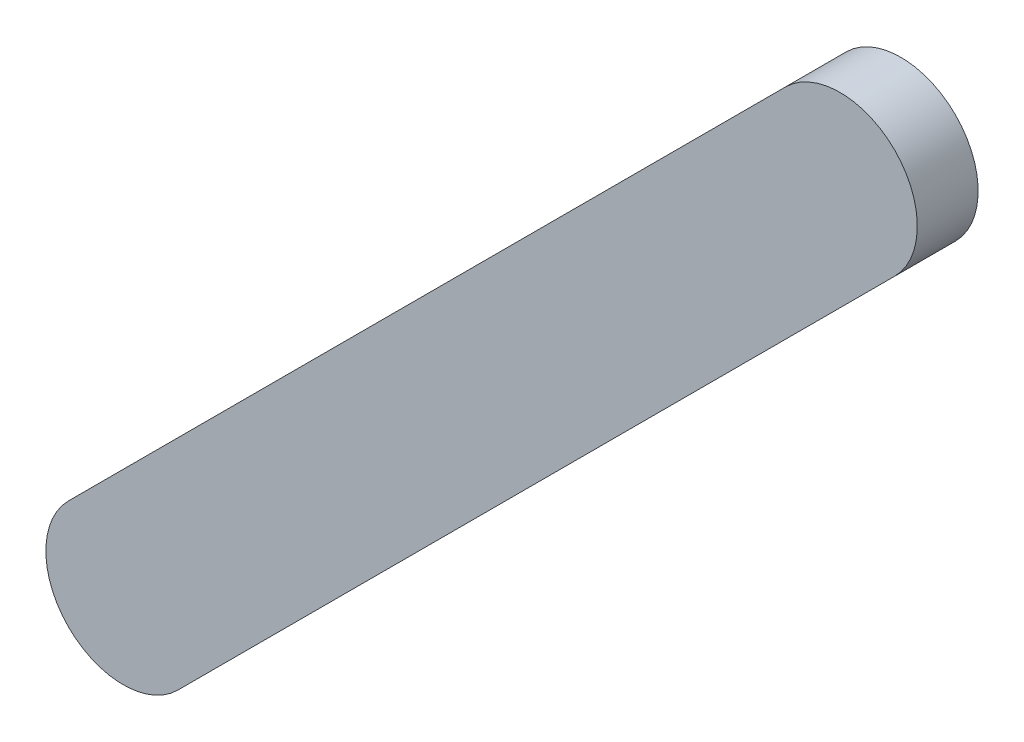
ISO-10303-21;
HEADER;
FILE_DESCRIPTION(('STEP AP214'),'2;1');
FILE_NAME('part.step','',(''),(''),'','','');
FILE_SCHEMA(('AUTOMOTIVE_DESIGN { 1 0 10303 214 1 1 1 1 }'));
ENDSEC;
DATA;
#1=APPLICATION_CONTEXT('core data for automotive mechanical design processes');
#2=APPLICATION_PROTOCOL_DEFINITION('international standard','automotive_design',2000,#1);
#3=PRODUCT_CONTEXT('',#1,'mechanical');
#4=PRODUCT('Part','Part','',(#3));
#5=PRODUCT_RELATED_PRODUCT_CATEGORY('part','',(#4));
#6=PRODUCT_DEFINITION_FORMATION('','',#4);
#7=PRODUCT_DEFINITION_CONTEXT('part definition',#1,'design');
#8=PRODUCT_DEFINITION('design','',#6,#7);
#9=PRODUCT_DEFINITION_SHAPE('','',#8);
#10=(LENGTH_UNIT() NAMED_UNIT(*) SI_UNIT(.MILLI.,.METRE.));
#11=(NAMED_UNIT(*) PLANE_ANGLE_UNIT() SI_UNIT($,.RADIAN.));
#12=(NAMED_UNIT(*) SI_UNIT($,.STERADIAN.) SOLID_ANGLE_UNIT());
#13=UNCERTAINTY_MEASURE_WITH_UNIT(LENGTH_MEASURE(1.E-05),#10,'distance_accuracy_value','');
#14=(GEOMETRIC_REPRESENTATION_CONTEXT(3) GLOBAL_UNCERTAINTY_ASSIGNED_CONTEXT((#13)) GLOBAL_UNIT_ASSIGNED_CONTEXT((#10,
#11,#12)) REPRESENTATION_CONTEXT('',''));
#15=CARTESIAN_POINT('',(0.,0.,0.));
#16=DIRECTION('',(0.,0.,1.));
#17=DIRECTION('',(1.,0.,0.));
#18=AXIS2_PLACEMENT_3D('',#15,#16,#17);
#19=CARTESIAN_POINT('',(148.1346034,64.84439406,0.));
#20=DIRECTION('',(-0.707106781186548,0.707106781186548,0.));
#21=DIRECTION('',(0.707106781186548,0.707106781186548,0.));
#22=AXIS2_PLACEMENT_3D('',#19,#20,#21);
#23=PLANE('',#22);
#24=DIRECTION('',(0.707106781186548,0.707106781186548,0.));
#25=VECTOR('',#24,1.);
#26=CARTESIAN_POINT('',(148.1346034,64.84439406,0.1999996));
#27=LINE('',#26,#25);
#28=CARTESIAN_POINT('',(148.1346034,64.84439406,0.1999996));
#29=VERTEX_POINT('',#28);
#30=CARTESIAN_POINT('',(150.49110618,67.20089684,0.1999996));
#31=VERTEX_POINT('',#30);
#32=EDGE_CURVE('E11',#29,#31,#27,.T.);
#33=ORIENTED_EDGE('',*,*,#32,.F.);
#34=DIRECTION('',(0.,0.,1.));
#35=VECTOR('',#34,1.);
#36=CARTESIAN_POINT('',(148.1346034,64.84439406,0.));
#37=LINE('',#36,#35);
#38=CARTESIAN_POINT('',(148.1346034,64.84439406,0.));
#39=VERTEX_POINT('',#38);
#40=EDGE_CURVE('E24',#39,#29,#37,.T.);
#41=ORIENTED_EDGE('',*,*,#40,.F.);
#42=DIRECTION('',(0.707106781186548,0.707106781186548,0.));
#43=VECTOR('',#42,1.);
#44=CARTESIAN_POINT('',(148.1346034,64.84439406,0.));
#45=LINE('',#44,#43);
#46=CARTESIAN_POINT('',(150.49110618,67.20089684,0.));
#47=VERTEX_POINT('',#46);
#48=EDGE_CURVE('E75',#39,#47,#45,.T.);
#49=ORIENTED_EDGE('',*,*,#48,.T.);
#50=DIRECTION('',(0.,0.,1.));
#51=VECTOR('',#50,1.);
#52=CARTESIAN_POINT('',(150.49110618,67.20089684,0.));
#53=LINE('',#52,#51);
#54=EDGE_CURVE('E37',#47,#31,#53,.T.);
#55=ORIENTED_EDGE('',*,*,#54,.T.);
#56=EDGE_LOOP('',(#33,#41,#49,#55));
#57=FACE_BOUND('',#56,.T.);
#58=ADVANCED_FACE('F17',(#57),#23,.F.);
#59=CARTESIAN_POINT('',(150.31150151,67.38050151,0.));
#60=DIRECTION('',(0.,0.,-1.));
#61=DIRECTION('',(0.707106781186548,-0.707106781186548,0.));
#62=AXIS2_PLACEMENT_3D('',#59,#60,#61);
#63=CYLINDRICAL_SURFACE('',#62,0.253999360179549);
#64=CARTESIAN_POINT('',(150.31150151,67.38050151,0.1999996));
#65=DIRECTION('',(0.,0.,1.));
#66=DIRECTION('',(0.707106781186548,-0.707106781186548,0.));
#67=AXIS2_PLACEMENT_3D('',#64,#65,#66);
#68=CIRCLE('',#67,0.253999360179549);
#69=CARTESIAN_POINT('',(150.13189684,67.56010618,0.1999996));
#70=VERTEX_POINT('',#69);
#71=EDGE_CURVE('E83',#31,#70,#68,.T.);
#72=ORIENTED_EDGE('',*,*,#71,.F.);
#73=ORIENTED_EDGE('',*,*,#54,.F.);
#74=CARTESIAN_POINT('',(150.31150151,67.38050151,0.));
#75=DIRECTION('',(0.,0.,1.));
#76=DIRECTION('',(0.707106781186548,-0.707106781186548,0.));
#77=AXIS2_PLACEMENT_3D('',#74,#75,#76);
#78=CIRCLE('',#77,0.253999360179549);
#79=CARTESIAN_POINT('',(150.13189684,67.56010618,0.));
#80=VERTEX_POINT('',#79);
#81=EDGE_CURVE('E81',#47,#80,#78,.T.);
#82=ORIENTED_EDGE('',*,*,#81,.T.);
#83=DIRECTION('',(0.,0.,1.));
#84=VECTOR('',#83,1.);
#85=CARTESIAN_POINT('',(150.13189684,67.56010618,0.));
#86=LINE('',#85,#84);
#87=EDGE_CURVE('E67',#80,#70,#86,.T.);
#88=ORIENTED_EDGE('',*,*,#87,.T.);
#89=EDGE_LOOP('',(#72,#73,#82,#88));
#90=FACE_BOUND('',#89,.T.);
#91=ADVANCED_FACE('F89',(#90),#63,.T.);
#92=CARTESIAN_POINT('',(150.13189684,67.56010618,0.));
#93=DIRECTION('',(0.70710678118655,-0.707106781186545,0.));
#94=DIRECTION('',(-0.707106781186545,-0.70710678118655,0.));
#95=AXIS2_PLACEMENT_3D('',#92,#93,#94);
#96=PLANE('',#95);
#97=DIRECTION('',(-0.707106781186545,-0.70710678118655,0.));
#98=VECTOR('',#97,1.);
#99=CARTESIAN_POINT('',(150.13189684,67.56010618,0.1999996));
#100=LINE('',#99,#98);
#101=CARTESIAN_POINT('',(147.77539406,65.2036034,0.1999996));
#102=VERTEX_POINT('',#101);
#103=EDGE_CURVE('E71',#70,#102,#100,.T.);
#104=ORIENTED_EDGE('',*,*,#103,.F.);
#105=ORIENTED_EDGE('',*,*,#87,.F.);
#106=DIRECTION('',(-0.707106781186545,-0.70710678118655,0.));
#107=VECTOR('',#106,1.);
#108=CARTESIAN_POINT('',(150.13189684,67.56010618,0.));
#109=LINE('',#108,#107);
#110=CARTESIAN_POINT('',(147.77539406,65.2036034,0.));
#111=VERTEX_POINT('',#110);
#112=EDGE_CURVE('E63',#80,#111,#109,.T.);
#113=ORIENTED_EDGE('',*,*,#112,.T.);
#114=DIRECTION('',(0.,0.,1.));
#115=VECTOR('',#114,1.);
#116=CARTESIAN_POINT('',(147.77539406,65.2036034,0.));
#117=LINE('',#116,#115);
#118=EDGE_CURVE('E53',#111,#102,#117,.T.);
#119=ORIENTED_EDGE('',*,*,#118,.T.);
#120=EDGE_LOOP('',(#104,#105,#113,#119));
#121=FACE_BOUND('',#120,.T.);
#122=ADVANCED_FACE('F66',(#121),#96,.F.);
#123=CARTESIAN_POINT('',(147.95499873,65.02399873,0.));
#124=DIRECTION('',(0.,0.,-1.));
#125=DIRECTION('',(-0.707106781186548,0.707106781186548,0.));
#126=AXIS2_PLACEMENT_3D('',#123,#124,#125);
#127=CYLINDRICAL_SURFACE('',#126,0.253999360179542);
#128=CARTESIAN_POINT('',(147.95499873,65.02399873,0.1999996));
#129=DIRECTION('',(0.,0.,1.));
#130=DIRECTION('',(-0.707106781186548,0.707106781186548,0.));
#131=AXIS2_PLACEMENT_3D('',#128,#129,#130);
#132=CIRCLE('',#131,0.253999360179542);
#133=EDGE_CURVE('E59',#102,#29,#132,.T.);
#134=ORIENTED_EDGE('',*,*,#133,.F.);
#135=ORIENTED_EDGE('',*,*,#118,.F.);
#136=CARTESIAN_POINT('',(147.95499873,65.02399873,0.));
#137=DIRECTION('',(0.,0.,1.));
#138=DIRECTION('',(-0.707106781186548,0.707106781186548,0.));
#139=AXIS2_PLACEMENT_3D('',#136,#137,#138);
#140=CIRCLE('',#139,0.253999360179542);
#141=EDGE_CURVE('E57',#111,#39,#140,.T.);
#142=ORIENTED_EDGE('',*,*,#141,.T.);
#143=ORIENTED_EDGE('',*,*,#40,.T.);
#144=EDGE_LOOP('',(#134,#135,#142,#143));
#145=FACE_BOUND('',#144,.T.);
#146=ADVANCED_FACE('F55',(#145),#127,.T.);
#147=CARTESIAN_POINT('',(148.1346034,64.84439406,0.));
#148=DIRECTION('',(0.,0.,-1.));
#149=DIRECTION('',(-1.,0.,0.));
#150=AXIS2_PLACEMENT_3D('',#147,#148,#149);
#151=PLANE('',#150);
#152=ORIENTED_EDGE('',*,*,#141,.F.);
#153=ORIENTED_EDGE('',*,*,#112,.F.);
#154=ORIENTED_EDGE('',*,*,#81,.F.);
#155=ORIENTED_EDGE('',*,*,#48,.F.);
#156=EDGE_LOOP('',(#152,#153,#154,#155));
#157=FACE_BOUND('',#156,.T.);
#158=ADVANCED_FACE('F74',(#157),#151,.T.);
#159=CARTESIAN_POINT('',(148.1346034,64.84439406,0.1999996));
#160=DIRECTION('',(0.,0.,-1.));
#161=DIRECTION('',(-1.,0.,0.));
#162=AXIS2_PLACEMENT_3D('',#159,#160,#161);
#163=PLANE('',#162);
#164=ORIENTED_EDGE('',*,*,#32,.T.);
#165=ORIENTED_EDGE('',*,*,#71,.T.);
#166=ORIENTED_EDGE('',*,*,#103,.T.);
#167=ORIENTED_EDGE('',*,*,#133,.T.);
#168=EDGE_LOOP('',(#164,#165,#166,#167));
#169=FACE_BOUND('',#168,.T.);
#170=ADVANCED_FACE('F91',(#169),#163,.F.);
#171=CLOSED_SHELL('',(#58,#91,#122,#146,#158,#170));
#172=MANIFOLD_SOLID_BREP('B1',#171);
#173=ADVANCED_BREP_SHAPE_REPRESENTATION('',(#18,#172),#14);
#174=SHAPE_DEFINITION_REPRESENTATION(#9,#173);
ENDSEC;
END-ISO-10303-21;
